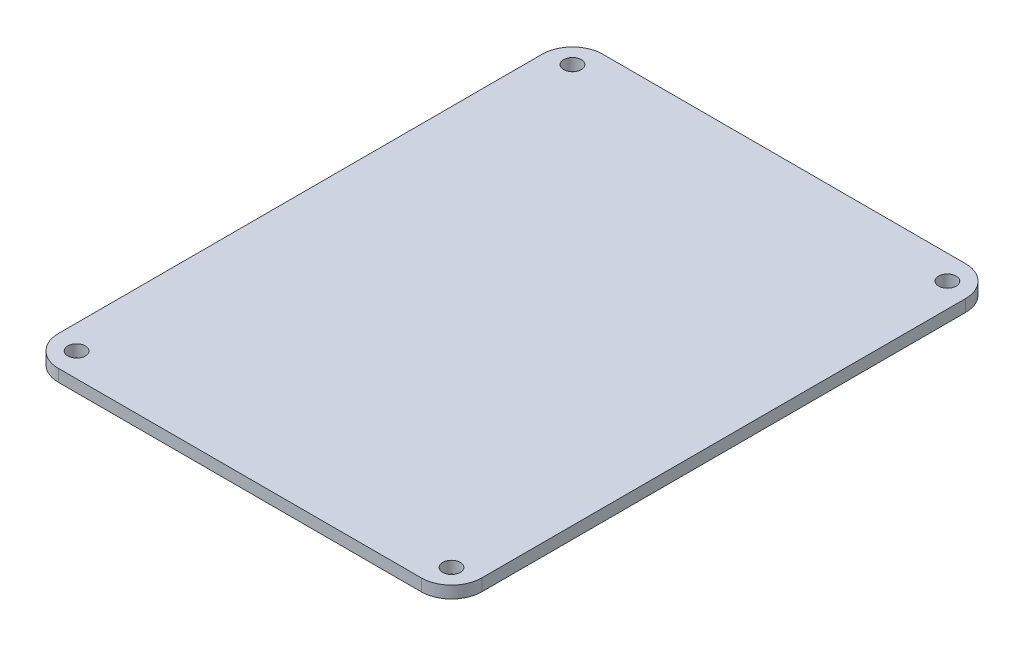
ISO-10303-21;
HEADER;
FILE_DESCRIPTION(('STEP AP214'),'2;1');
FILE_NAME('part.step','',(''),(''),'','','');
FILE_SCHEMA(('AUTOMOTIVE_DESIGN { 1 0 10303 214 1 1 1 1 }'));
ENDSEC;
DATA;
#1=APPLICATION_CONTEXT('core data for automotive mechanical design processes');
#2=APPLICATION_PROTOCOL_DEFINITION('international standard','automotive_design',2000,#1);
#3=PRODUCT_CONTEXT('',#1,'mechanical');
#4=PRODUCT('Part','Part','',(#3));
#5=PRODUCT_RELATED_PRODUCT_CATEGORY('part','',(#4));
#6=PRODUCT_DEFINITION_FORMATION('','',#4);
#7=PRODUCT_DEFINITION_CONTEXT('part definition',#1,'design');
#8=PRODUCT_DEFINITION('design','',#6,#7);
#9=PRODUCT_DEFINITION_SHAPE('','',#8);
#10=(LENGTH_UNIT() NAMED_UNIT(*) SI_UNIT(.MILLI.,.METRE.));
#11=(NAMED_UNIT(*) PLANE_ANGLE_UNIT() SI_UNIT($,.RADIAN.));
#12=(NAMED_UNIT(*) SI_UNIT($,.STERADIAN.) SOLID_ANGLE_UNIT());
#13=UNCERTAINTY_MEASURE_WITH_UNIT(LENGTH_MEASURE(1.E-05),#10,'distance_accuracy_value','');
#14=(GEOMETRIC_REPRESENTATION_CONTEXT(3) GLOBAL_UNCERTAINTY_ASSIGNED_CONTEXT((#13)) GLOBAL_UNIT_ASSIGNED_CONTEXT((#10,
#11,#12)) REPRESENTATION_CONTEXT('',''));
#15=CARTESIAN_POINT('',(0.,0.,0.));
#16=DIRECTION('',(0.,0.,1.));
#17=DIRECTION('',(1.,0.,0.));
#18=AXIS2_PLACEMENT_3D('',#15,#16,#17);
#19=CARTESIAN_POINT('',(44.45,2.54,57.15));
#20=DIRECTION('',(-1.,0.,0.));
#21=DIRECTION('',(0.,0.,1.));
#22=AXIS2_PLACEMENT_3D('',#19,#20,#21);
#23=PLANE('',#22);
#24=DIRECTION('',(0.,0.,-1.));
#25=VECTOR('',#24,1.);
#26=CARTESIAN_POINT('',(44.45,2.54,57.15));
#27=LINE('',#26,#25);
#28=CARTESIAN_POINT('',(44.45,2.54,50.8));
#29=VERTEX_POINT('',#28);
#30=CARTESIAN_POINT('',(44.45,2.54,-50.8));
#31=VERTEX_POINT('',#30);
#32=EDGE_CURVE('E133',#29,#31,#27,.T.);
#33=ORIENTED_EDGE('',*,*,#32,.F.);
#34=DIRECTION('',(0.,-1.,0.));
#35=VECTOR('',#34,1.);
#36=CARTESIAN_POINT('',(44.45,2.54,50.8));
#37=LINE('',#36,#35);
#38=CARTESIAN_POINT('',(44.45,0.,50.8));
#39=VERTEX_POINT('',#38);
#40=EDGE_CURVE('E159',#29,#39,#37,.T.);
#41=ORIENTED_EDGE('',*,*,#40,.T.);
#42=DIRECTION('',(0.,0.,-1.));
#43=VECTOR('',#42,1.);
#44=CARTESIAN_POINT('',(44.45,0.,57.15));
#45=LINE('',#44,#43);
#46=CARTESIAN_POINT('',(44.45,0.,-50.8));
#47=VERTEX_POINT('',#46);
#48=EDGE_CURVE('E165',#39,#47,#45,.T.);
#49=ORIENTED_EDGE('',*,*,#48,.T.);
#50=DIRECTION('',(0.,-1.,0.));
#51=VECTOR('',#50,1.);
#52=CARTESIAN_POINT('',(44.45,2.54,-50.8));
#53=LINE('',#52,#51);
#54=EDGE_CURVE('E157',#47,#31,#53,.F.);
#55=ORIENTED_EDGE('',*,*,#54,.T.);
#56=EDGE_LOOP('',(#33,#41,#49,#55));
#57=FACE_BOUND('',#56,.T.);
#58=ADVANCED_FACE('F41',(#57),#23,.F.);
#59=CARTESIAN_POINT('',(-44.45,2.54,-57.15));
#60=DIRECTION('',(0.,0.,1.));
#61=DIRECTION('',(1.,0.,0.));
#62=AXIS2_PLACEMENT_3D('',#59,#60,#61);
#63=PLANE('',#62);
#64=DIRECTION('',(-1.,0.,0.));
#65=VECTOR('',#64,1.);
#66=CARTESIAN_POINT('',(-44.45,2.54,-57.15));
#67=LINE('',#66,#65);
#68=CARTESIAN_POINT('',(38.1,2.54,-57.15));
#69=VERTEX_POINT('',#68);
#70=CARTESIAN_POINT('',(-38.1,2.54,-57.15));
#71=VERTEX_POINT('',#70);
#72=EDGE_CURVE('E136',#69,#71,#67,.T.);
#73=ORIENTED_EDGE('',*,*,#72,.F.);
#74=DIRECTION('',(0.,-1.,0.));
#75=VECTOR('',#74,1.);
#76=CARTESIAN_POINT('',(38.1,2.54,-57.15));
#77=LINE('',#76,#75);
#78=CARTESIAN_POINT('',(38.1,0.,-57.15));
#79=VERTEX_POINT('',#78);
#80=EDGE_CURVE('E11',#69,#79,#77,.T.);
#81=ORIENTED_EDGE('',*,*,#80,.T.);
#82=DIRECTION('',(-1.,0.,0.));
#83=VECTOR('',#82,1.);
#84=CARTESIAN_POINT('',(-44.45,0.,-57.15));
#85=LINE('',#84,#83);
#86=CARTESIAN_POINT('',(-38.1,0.,-57.15));
#87=VERTEX_POINT('',#86);
#88=EDGE_CURVE('E138',#79,#87,#85,.T.);
#89=ORIENTED_EDGE('',*,*,#88,.T.);
#90=DIRECTION('',(0.,-1.,0.));
#91=VECTOR('',#90,1.);
#92=CARTESIAN_POINT('',(-38.1,2.54,-57.15));
#93=LINE('',#92,#91);
#94=EDGE_CURVE('E49',#87,#71,#93,.F.);
#95=ORIENTED_EDGE('',*,*,#94,.T.);
#96=EDGE_LOOP('',(#73,#81,#89,#95));
#97=FACE_BOUND('',#96,.T.);
#98=ADVANCED_FACE('F216',(#97),#63,.F.);
#99=CARTESIAN_POINT('',(-44.45,2.54,57.15));
#100=DIRECTION('',(1.,0.,0.));
#101=DIRECTION('',(0.,0.,-1.));
#102=AXIS2_PLACEMENT_3D('',#99,#100,#101);
#103=PLANE('',#102);
#104=DIRECTION('',(0.,0.,1.));
#105=VECTOR('',#104,1.);
#106=CARTESIAN_POINT('',(-44.45,0.,57.15));
#107=LINE('',#106,#105);
#108=CARTESIAN_POINT('',(-44.45,0.,-50.8));
#109=VERTEX_POINT('',#108);
#110=CARTESIAN_POINT('',(-44.45,0.,50.8));
#111=VERTEX_POINT('',#110);
#112=EDGE_CURVE('E134',#109,#111,#107,.T.);
#113=ORIENTED_EDGE('',*,*,#112,.T.);
#114=DIRECTION('',(0.,-1.,0.));
#115=VECTOR('',#114,1.);
#116=CARTESIAN_POINT('',(-44.45,2.54,50.8));
#117=LINE('',#116,#115);
#118=CARTESIAN_POINT('',(-44.45,2.54,50.8));
#119=VERTEX_POINT('',#118);
#120=EDGE_CURVE('E112',#111,#119,#117,.F.);
#121=ORIENTED_EDGE('',*,*,#120,.T.);
#122=DIRECTION('',(0.,0.,1.));
#123=VECTOR('',#122,1.);
#124=CARTESIAN_POINT('',(-44.45,2.54,57.15));
#125=LINE('',#124,#123);
#126=CARTESIAN_POINT('',(-44.45,2.54,-50.8));
#127=VERTEX_POINT('',#126);
#128=EDGE_CURVE('E177',#127,#119,#125,.T.);
#129=ORIENTED_EDGE('',*,*,#128,.F.);
#130=DIRECTION('',(0.,-1.,0.));
#131=VECTOR('',#130,1.);
#132=CARTESIAN_POINT('',(-44.45,2.54,-50.8));
#133=LINE('',#132,#131);
#134=EDGE_CURVE('E117',#127,#109,#133,.T.);
#135=ORIENTED_EDGE('',*,*,#134,.T.);
#136=EDGE_LOOP('',(#113,#121,#129,#135));
#137=FACE_BOUND('',#136,.T.);
#138=ADVANCED_FACE('F214',(#137),#103,.F.);
#139=CARTESIAN_POINT('',(-44.45,2.54,57.15));
#140=DIRECTION('',(0.,0.,-1.));
#141=DIRECTION('',(-1.,0.,0.));
#142=AXIS2_PLACEMENT_3D('',#139,#140,#141);
#143=PLANE('',#142);
#144=DIRECTION('',(1.,0.,0.));
#145=VECTOR('',#144,1.);
#146=CARTESIAN_POINT('',(-44.45,2.54,57.15));
#147=LINE('',#146,#145);
#148=CARTESIAN_POINT('',(-38.1,2.54,57.15));
#149=VERTEX_POINT('',#148);
#150=CARTESIAN_POINT('',(38.1,2.54,57.15));
#151=VERTEX_POINT('',#150);
#152=EDGE_CURVE('E127',#149,#151,#147,.T.);
#153=ORIENTED_EDGE('',*,*,#152,.F.);
#154=DIRECTION('',(0.,-1.,0.));
#155=VECTOR('',#154,1.);
#156=CARTESIAN_POINT('',(-38.1,2.54,57.15));
#157=LINE('',#156,#155);
#158=CARTESIAN_POINT('',(-38.1,0.,57.15));
#159=VERTEX_POINT('',#158);
#160=EDGE_CURVE('E111',#149,#159,#157,.T.);
#161=ORIENTED_EDGE('',*,*,#160,.T.);
#162=DIRECTION('',(1.,0.,0.));
#163=VECTOR('',#162,1.);
#164=CARTESIAN_POINT('',(-44.45,0.,57.15));
#165=LINE('',#164,#163);
#166=CARTESIAN_POINT('',(38.1,0.,57.15));
#167=VERTEX_POINT('',#166);
#168=EDGE_CURVE('E124',#159,#167,#165,.T.);
#169=ORIENTED_EDGE('',*,*,#168,.T.);
#170=DIRECTION('',(0.,-1.,0.));
#171=VECTOR('',#170,1.);
#172=CARTESIAN_POINT('',(38.1,2.54,57.15));
#173=LINE('',#172,#171);
#174=EDGE_CURVE('E129',#167,#151,#173,.F.);
#175=ORIENTED_EDGE('',*,*,#174,.T.);
#176=EDGE_LOOP('',(#153,#161,#169,#175));
#177=FACE_BOUND('',#176,.T.);
#178=ADVANCED_FACE('F123',(#177),#143,.F.);
#179=CARTESIAN_POINT('',(0.,2.54,0.));
#180=DIRECTION('',(0.,-1.,0.));
#181=DIRECTION('',(0.,0.,-1.));
#182=AXIS2_PLACEMENT_3D('',#179,#180,#181);
#183=PLANE('',#182);
#184=CARTESIAN_POINT('',(39.37,2.54,-52.07));
#185=DIRECTION('',(0.,1.,0.));
#186=DIRECTION('',(0.,0.,1.));
#187=AXIS2_PLACEMENT_3D('',#184,#185,#186);
#188=CIRCLE('',#187,1.8415);
#189=CARTESIAN_POINT('',(39.37,2.54,-50.2285));
#190=VERTEX_POINT('',#189);
#191=EDGE_CURVE('E182',#190,#190,#188,.T.);
#192=ORIENTED_EDGE('',*,*,#191,.F.);
#193=EDGE_LOOP('',(#192));
#194=FACE_BOUND('',#193,.T.);
#195=CARTESIAN_POINT('',(-39.37,2.54,52.07));
#196=DIRECTION('',(0.,1.,0.));
#197=DIRECTION('',(0.,0.,1.));
#198=AXIS2_PLACEMENT_3D('',#195,#196,#197);
#199=CIRCLE('',#198,1.8415);
#200=CARTESIAN_POINT('',(-39.37,2.54,53.9115));
#201=VERTEX_POINT('',#200);
#202=EDGE_CURVE('E187',#201,#201,#199,.T.);
#203=ORIENTED_EDGE('',*,*,#202,.F.);
#204=EDGE_LOOP('',(#203));
#205=FACE_BOUND('',#204,.T.);
#206=CARTESIAN_POINT('',(39.37,2.54,52.07));
#207=DIRECTION('',(0.,1.,0.));
#208=DIRECTION('',(0.,0.,1.));
#209=AXIS2_PLACEMENT_3D('',#206,#207,#208);
#210=CIRCLE('',#209,1.8415);
#211=CARTESIAN_POINT('',(39.37,2.54,53.9115));
#212=VERTEX_POINT('',#211);
#213=EDGE_CURVE('E188',#212,#212,#210,.T.);
#214=ORIENTED_EDGE('',*,*,#213,.F.);
#215=EDGE_LOOP('',(#214));
#216=FACE_BOUND('',#215,.T.);
#217=CARTESIAN_POINT('',(-39.37,2.54,-52.07));
#218=DIRECTION('',(0.,1.,0.));
#219=DIRECTION('',(0.,0.,1.));
#220=AXIS2_PLACEMENT_3D('',#217,#218,#219);
#221=CIRCLE('',#220,1.8415);
#222=CARTESIAN_POINT('',(-39.37,2.54,-50.2285));
#223=VERTEX_POINT('',#222);
#224=EDGE_CURVE('E173',#223,#223,#221,.T.);
#225=ORIENTED_EDGE('',*,*,#224,.F.);
#226=EDGE_LOOP('',(#225));
#227=FACE_BOUND('',#226,.T.);
#228=ORIENTED_EDGE('',*,*,#128,.T.);
#229=CARTESIAN_POINT('',(-38.1,2.54,50.8));
#230=DIRECTION('',(0.,-1.,0.));
#231=DIRECTION('',(0.,0.,-1.));
#232=AXIS2_PLACEMENT_3D('',#229,#230,#231);
#233=CIRCLE('',#232,6.35);
#234=EDGE_CURVE('E155',#119,#149,#233,.F.);
#235=ORIENTED_EDGE('',*,*,#234,.T.);
#236=ORIENTED_EDGE('',*,*,#152,.T.);
#237=CARTESIAN_POINT('',(38.1,2.54,50.8));
#238=DIRECTION('',(0.,-1.,0.));
#239=DIRECTION('',(0.,0.,-1.));
#240=AXIS2_PLACEMENT_3D('',#237,#238,#239);
#241=CIRCLE('',#240,6.35);
#242=EDGE_CURVE('E153',#151,#29,#241,.F.);
#243=ORIENTED_EDGE('',*,*,#242,.T.);
#244=ORIENTED_EDGE('',*,*,#32,.T.);
#245=CARTESIAN_POINT('',(38.1,2.54,-50.8));
#246=DIRECTION('',(0.,-1.,0.));
#247=DIRECTION('',(0.,0.,-1.));
#248=AXIS2_PLACEMENT_3D('',#245,#246,#247);
#249=CIRCLE('',#248,6.35);
#250=EDGE_CURVE('E62',#31,#69,#249,.F.);
#251=ORIENTED_EDGE('',*,*,#250,.T.);
#252=ORIENTED_EDGE('',*,*,#72,.T.);
#253=CARTESIAN_POINT('',(-38.1,2.54,-50.8));
#254=DIRECTION('',(0.,-1.,0.));
#255=DIRECTION('',(0.,0.,-1.));
#256=AXIS2_PLACEMENT_3D('',#253,#254,#255);
#257=CIRCLE('',#256,6.35);
#258=EDGE_CURVE('E150',#71,#127,#257,.F.);
#259=ORIENTED_EDGE('',*,*,#258,.T.);
#260=EDGE_LOOP('',(#228,#235,#236,#243,#244,#251,#252,#259));
#261=FACE_BOUND('',#260,.T.);
#262=ADVANCED_FACE('F204',(#194,#205,#216,#227,#261),#183,.F.);
#263=CARTESIAN_POINT('',(0.,0.,0.));
#264=DIRECTION('',(0.,-1.,0.));
#265=DIRECTION('',(0.,0.,-1.));
#266=AXIS2_PLACEMENT_3D('',#263,#264,#265);
#267=PLANE('',#266);
#268=CARTESIAN_POINT('',(39.37,0.,-52.07));
#269=DIRECTION('',(0.,1.,0.));
#270=DIRECTION('',(0.,0.,1.));
#271=AXIS2_PLACEMENT_3D('',#268,#269,#270);
#272=CIRCLE('',#271,1.8415);
#273=CARTESIAN_POINT('',(39.37,0.,-50.2285));
#274=VERTEX_POINT('',#273);
#275=EDGE_CURVE('E191',#274,#274,#272,.T.);
#276=ORIENTED_EDGE('',*,*,#275,.T.);
#277=EDGE_LOOP('',(#276));
#278=FACE_BOUND('',#277,.T.);
#279=CARTESIAN_POINT('',(-39.37,0.,52.07));
#280=DIRECTION('',(0.,1.,0.));
#281=DIRECTION('',(0.,0.,1.));
#282=AXIS2_PLACEMENT_3D('',#279,#280,#281);
#283=CIRCLE('',#282,1.8415);
#284=CARTESIAN_POINT('',(-39.37,0.,53.9115));
#285=VERTEX_POINT('',#284);
#286=EDGE_CURVE('E184',#285,#285,#283,.T.);
#287=ORIENTED_EDGE('',*,*,#286,.T.);
#288=EDGE_LOOP('',(#287));
#289=FACE_BOUND('',#288,.T.);
#290=CARTESIAN_POINT('',(39.37,0.,52.07));
#291=DIRECTION('',(0.,1.,0.));
#292=DIRECTION('',(0.,0.,1.));
#293=AXIS2_PLACEMENT_3D('',#290,#291,#292);
#294=CIRCLE('',#293,1.8415);
#295=CARTESIAN_POINT('',(39.37,0.,53.9115));
#296=VERTEX_POINT('',#295);
#297=EDGE_CURVE('E196',#296,#296,#294,.T.);
#298=ORIENTED_EDGE('',*,*,#297,.T.);
#299=EDGE_LOOP('',(#298));
#300=FACE_BOUND('',#299,.T.);
#301=CARTESIAN_POINT('',(-39.37,0.,-52.07));
#302=DIRECTION('',(0.,1.,0.));
#303=DIRECTION('',(0.,0.,1.));
#304=AXIS2_PLACEMENT_3D('',#301,#302,#303);
#305=CIRCLE('',#304,1.8415);
#306=CARTESIAN_POINT('',(-39.37,0.,-50.2285));
#307=VERTEX_POINT('',#306);
#308=EDGE_CURVE('E170',#307,#307,#305,.T.);
#309=ORIENTED_EDGE('',*,*,#308,.T.);
#310=EDGE_LOOP('',(#309));
#311=FACE_BOUND('',#310,.T.);
#312=ORIENTED_EDGE('',*,*,#168,.F.);
#313=CARTESIAN_POINT('',(-38.1,0.,50.8));
#314=DIRECTION('',(0.,-1.,0.));
#315=DIRECTION('',(0.,0.,-1.));
#316=AXIS2_PLACEMENT_3D('',#313,#314,#315);
#317=CIRCLE('',#316,6.35);
#318=EDGE_CURVE('E107',#159,#111,#317,.T.);
#319=ORIENTED_EDGE('',*,*,#318,.T.);
#320=ORIENTED_EDGE('',*,*,#112,.F.);
#321=CARTESIAN_POINT('',(-38.1,0.,-50.8));
#322=DIRECTION('',(0.,-1.,0.));
#323=DIRECTION('',(0.,0.,-1.));
#324=AXIS2_PLACEMENT_3D('',#321,#322,#323);
#325=CIRCLE('',#324,6.35);
#326=EDGE_CURVE('E128',#109,#87,#325,.T.);
#327=ORIENTED_EDGE('',*,*,#326,.T.);
#328=ORIENTED_EDGE('',*,*,#88,.F.);
#329=CARTESIAN_POINT('',(38.1,0.,-50.8));
#330=DIRECTION('',(0.,-1.,0.));
#331=DIRECTION('',(0.,0.,-1.));
#332=AXIS2_PLACEMENT_3D('',#329,#330,#331);
#333=CIRCLE('',#332,6.35);
#334=EDGE_CURVE('E144',#79,#47,#333,.T.);
#335=ORIENTED_EDGE('',*,*,#334,.T.);
#336=ORIENTED_EDGE('',*,*,#48,.F.);
#337=CARTESIAN_POINT('',(38.1,0.,50.8));
#338=DIRECTION('',(0.,-1.,0.));
#339=DIRECTION('',(0.,0.,-1.));
#340=AXIS2_PLACEMENT_3D('',#337,#338,#339);
#341=CIRCLE('',#340,6.35);
#342=EDGE_CURVE('E118',#39,#167,#341,.T.);
#343=ORIENTED_EDGE('',*,*,#342,.T.);
#344=EDGE_LOOP('',(#312,#319,#320,#327,#328,#335,#336,#343));
#345=FACE_BOUND('',#344,.T.);
#346=ADVANCED_FACE('F131',(#278,#289,#300,#311,#345),#267,.T.);
#347=CARTESIAN_POINT('',(-39.37,0.,-52.07));
#348=DIRECTION('',(0.,1.,0.));
#349=DIRECTION('',(0.,0.,1.));
#350=AXIS2_PLACEMENT_3D('',#347,#348,#349);
#351=CYLINDRICAL_SURFACE('',#350,1.8415);
#352=ORIENTED_EDGE('',*,*,#308,.F.);
#353=EDGE_LOOP('',(#352));
#354=FACE_BOUND('',#353,.T.);
#355=ORIENTED_EDGE('',*,*,#224,.T.);
#356=EDGE_LOOP('',(#355));
#357=FACE_BOUND('',#356,.T.);
#358=ADVANCED_FACE('F241',(#354,#357),#351,.F.);
#359=CARTESIAN_POINT('',(39.37,0.,52.07));
#360=DIRECTION('',(0.,1.,0.));
#361=DIRECTION('',(0.,0.,1.));
#362=AXIS2_PLACEMENT_3D('',#359,#360,#361);
#363=CYLINDRICAL_SURFACE('',#362,1.8415);
#364=ORIENTED_EDGE('',*,*,#297,.F.);
#365=EDGE_LOOP('',(#364));
#366=FACE_BOUND('',#365,.T.);
#367=ORIENTED_EDGE('',*,*,#213,.T.);
#368=EDGE_LOOP('',(#367));
#369=FACE_BOUND('',#368,.T.);
#370=ADVANCED_FACE('F202',(#366,#369),#363,.F.);
#371=CARTESIAN_POINT('',(-39.37,0.,52.07));
#372=DIRECTION('',(0.,1.,0.));
#373=DIRECTION('',(0.,0.,1.));
#374=AXIS2_PLACEMENT_3D('',#371,#372,#373);
#375=CYLINDRICAL_SURFACE('',#374,1.8415);
#376=ORIENTED_EDGE('',*,*,#286,.F.);
#377=EDGE_LOOP('',(#376));
#378=FACE_BOUND('',#377,.T.);
#379=ORIENTED_EDGE('',*,*,#202,.T.);
#380=EDGE_LOOP('',(#379));
#381=FACE_BOUND('',#380,.T.);
#382=ADVANCED_FACE('F247',(#378,#381),#375,.F.);
#383=CARTESIAN_POINT('',(39.37,0.,-52.07));
#384=DIRECTION('',(0.,1.,0.));
#385=DIRECTION('',(0.,0.,1.));
#386=AXIS2_PLACEMENT_3D('',#383,#384,#385);
#387=CYLINDRICAL_SURFACE('',#386,1.8415);
#388=ORIENTED_EDGE('',*,*,#275,.F.);
#389=EDGE_LOOP('',(#388));
#390=FACE_BOUND('',#389,.T.);
#391=ORIENTED_EDGE('',*,*,#191,.T.);
#392=EDGE_LOOP('',(#391));
#393=FACE_BOUND('',#392,.T.);
#394=ADVANCED_FACE('F227',(#390,#393),#387,.F.);
#395=CARTESIAN_POINT('',(-38.1,2.54,50.8));
#396=DIRECTION('',(0.,-1.,0.));
#397=DIRECTION('',(0.,0.,-1.));
#398=AXIS2_PLACEMENT_3D('',#395,#396,#397);
#399=CYLINDRICAL_SURFACE('',#398,6.35);
#400=ORIENTED_EDGE('',*,*,#234,.F.);
#401=ORIENTED_EDGE('',*,*,#120,.F.);
#402=ORIENTED_EDGE('',*,*,#318,.F.);
#403=ORIENTED_EDGE('',*,*,#160,.F.);
#404=EDGE_LOOP('',(#400,#401,#402,#403));
#405=FACE_BOUND('',#404,.T.);
#406=ADVANCED_FACE('F110',(#405),#399,.T.);
#407=CARTESIAN_POINT('',(38.1,2.54,50.8));
#408=DIRECTION('',(0.,-1.,0.));
#409=DIRECTION('',(0.,0.,-1.));
#410=AXIS2_PLACEMENT_3D('',#407,#408,#409);
#411=CYLINDRICAL_SURFACE('',#410,6.35);
#412=ORIENTED_EDGE('',*,*,#242,.F.);
#413=ORIENTED_EDGE('',*,*,#174,.F.);
#414=ORIENTED_EDGE('',*,*,#342,.F.);
#415=ORIENTED_EDGE('',*,*,#40,.F.);
#416=EDGE_LOOP('',(#412,#413,#414,#415));
#417=FACE_BOUND('',#416,.T.);
#418=ADVANCED_FACE('F220',(#417),#411,.T.);
#419=CARTESIAN_POINT('',(38.1,2.54,-50.8));
#420=DIRECTION('',(0.,-1.,0.));
#421=DIRECTION('',(0.,0.,-1.));
#422=AXIS2_PLACEMENT_3D('',#419,#420,#421);
#423=CYLINDRICAL_SURFACE('',#422,6.35);
#424=ORIENTED_EDGE('',*,*,#250,.F.);
#425=ORIENTED_EDGE('',*,*,#54,.F.);
#426=ORIENTED_EDGE('',*,*,#334,.F.);
#427=ORIENTED_EDGE('',*,*,#80,.F.);
#428=EDGE_LOOP('',(#424,#425,#426,#427));
#429=FACE_BOUND('',#428,.T.);
#430=ADVANCED_FACE('F219',(#429),#423,.T.);
#431=CARTESIAN_POINT('',(-38.1,2.54,-50.8));
#432=DIRECTION('',(0.,-1.,0.));
#433=DIRECTION('',(0.,0.,-1.));
#434=AXIS2_PLACEMENT_3D('',#431,#432,#433);
#435=CYLINDRICAL_SURFACE('',#434,6.35);
#436=ORIENTED_EDGE('',*,*,#258,.F.);
#437=ORIENTED_EDGE('',*,*,#94,.F.);
#438=ORIENTED_EDGE('',*,*,#326,.F.);
#439=ORIENTED_EDGE('',*,*,#134,.F.);
#440=EDGE_LOOP('',(#436,#437,#438,#439));
#441=FACE_BOUND('',#440,.T.);
#442=ADVANCED_FACE('F43',(#441),#435,.T.);
#443=CLOSED_SHELL('',(#58,#98,#138,#178,#262,#346,#358,#370,#382,#394,#406,#418,#430,#442));
#444=MANIFOLD_SOLID_BREP('B2',#443);
#445=ADVANCED_BREP_SHAPE_REPRESENTATION('',(#18,#444),#14);
#446=SHAPE_DEFINITION_REPRESENTATION(#9,#445);
ENDSEC;
END-ISO-10303-21;
